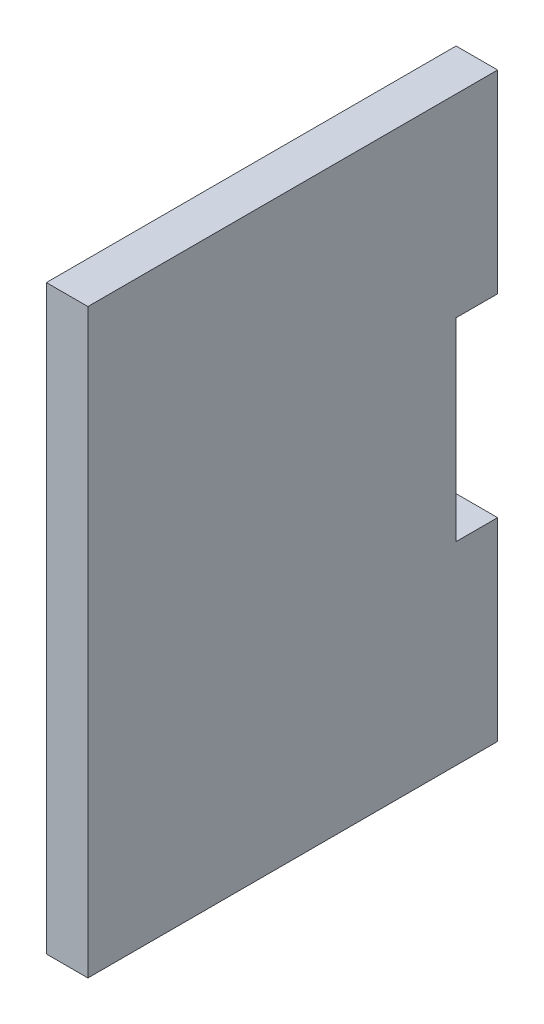
ISO-10303-21;
HEADER;
FILE_DESCRIPTION(('STEP AP214'),'2;1');
FILE_NAME('part.step','',(''),(''),'','','');
FILE_SCHEMA(('AUTOMOTIVE_DESIGN { 1 0 10303 214 1 1 1 1 }'));
ENDSEC;
DATA;
#1=APPLICATION_CONTEXT('core data for automotive mechanical design processes');
#2=APPLICATION_PROTOCOL_DEFINITION('international standard','automotive_design',2000,#1);
#3=PRODUCT_CONTEXT('',#1,'mechanical');
#4=PRODUCT('Part','Part','',(#3));
#5=PRODUCT_RELATED_PRODUCT_CATEGORY('part','',(#4));
#6=PRODUCT_DEFINITION_FORMATION('','',#4);
#7=PRODUCT_DEFINITION_CONTEXT('part definition',#1,'design');
#8=PRODUCT_DEFINITION('design','',#6,#7);
#9=PRODUCT_DEFINITION_SHAPE('','',#8);
#10=(LENGTH_UNIT() NAMED_UNIT(*) SI_UNIT(.MILLI.,.METRE.));
#11=(NAMED_UNIT(*) PLANE_ANGLE_UNIT() SI_UNIT($,.RADIAN.));
#12=(NAMED_UNIT(*) SI_UNIT($,.STERADIAN.) SOLID_ANGLE_UNIT());
#13=UNCERTAINTY_MEASURE_WITH_UNIT(LENGTH_MEASURE(1.E-05),#10,'distance_accuracy_value','');
#14=(GEOMETRIC_REPRESENTATION_CONTEXT(3) GLOBAL_UNCERTAINTY_ASSIGNED_CONTEXT((#13)) GLOBAL_UNIT_ASSIGNED_CONTEXT((#10,
#11,#12)) REPRESENTATION_CONTEXT('',''));
#15=CARTESIAN_POINT('',(0.,0.,0.));
#16=DIRECTION('',(0.,0.,1.));
#17=DIRECTION('',(1.,0.,0.));
#18=AXIS2_PLACEMENT_3D('',#15,#16,#17);
#19=CARTESIAN_POINT('',(3.175,0.,0.));
#20=DIRECTION('',(0.,1.,0.));
#21=DIRECTION('',(0.,0.,1.));
#22=AXIS2_PLACEMENT_3D('',#19,#20,#21);
#23=PLANE('',#22);
#24=DIRECTION('',(0.,0.,-1.));
#25=VECTOR('',#24,1.);
#26=CARTESIAN_POINT('',(0.,0.,0.));
#27=LINE('',#26,#25);
#28=CARTESIAN_POINT('',(0.,0.,0.));
#29=VERTEX_POINT('',#28);
#30=CARTESIAN_POINT('',(0.,0.,-31.3182));
#31=VERTEX_POINT('',#30);
#32=EDGE_CURVE('E131',#29,#31,#27,.T.);
#33=ORIENTED_EDGE('',*,*,#32,.T.);
#34=DIRECTION('',(-1.,0.,0.));
#35=VECTOR('',#34,1.);
#36=CARTESIAN_POINT('',(3.175,0.,-31.3182));
#37=LINE('',#36,#35);
#38=CARTESIAN_POINT('',(3.175,0.,-31.3182));
#39=VERTEX_POINT('',#38);
#40=EDGE_CURVE('E11',#39,#31,#37,.T.);
#41=ORIENTED_EDGE('',*,*,#40,.F.);
#42=DIRECTION('',(0.,0.,-1.));
#43=VECTOR('',#42,1.);
#44=CARTESIAN_POINT('',(3.175,0.,0.));
#45=LINE('',#44,#43);
#46=CARTESIAN_POINT('',(3.175,0.,0.));
#47=VERTEX_POINT('',#46);
#48=EDGE_CURVE('E150',#47,#39,#45,.T.);
#49=ORIENTED_EDGE('',*,*,#48,.F.);
#50=DIRECTION('',(-1.,0.,0.));
#51=VECTOR('',#50,1.);
#52=CARTESIAN_POINT('',(3.175,0.,0.));
#53=LINE('',#52,#51);
#54=EDGE_CURVE('E51',#47,#29,#53,.T.);
#55=ORIENTED_EDGE('',*,*,#54,.T.);
#56=EDGE_LOOP('',(#33,#41,#49,#55));
#57=FACE_BOUND('',#56,.T.);
#58=ADVANCED_FACE('F35',(#57),#23,.F.);
#59=CARTESIAN_POINT('',(3.175,0.,-31.3182));
#60=DIRECTION('',(0.,0.,1.));
#61=DIRECTION('',(1.,0.,0.));
#62=AXIS2_PLACEMENT_3D('',#59,#60,#61);
#63=PLANE('',#62);
#64=DIRECTION('',(0.,1.,0.));
#65=VECTOR('',#64,1.);
#66=CARTESIAN_POINT('',(0.,0.,-31.3182));
#67=LINE('',#66,#65);
#68=CARTESIAN_POINT('',(0.,14.8166666666667,-31.3182));
#69=VERTEX_POINT('',#68);
#70=EDGE_CURVE('E133',#31,#69,#67,.T.);
#71=ORIENTED_EDGE('',*,*,#70,.T.);
#72=DIRECTION('',(-1.,0.,0.));
#73=VECTOR('',#72,1.);
#74=CARTESIAN_POINT('',(3.175,14.8166666666667,-31.3182));
#75=LINE('',#74,#73);
#76=CARTESIAN_POINT('',(3.175,14.8166666666667,-31.3182));
#77=VERTEX_POINT('',#76);
#78=EDGE_CURVE('E43',#77,#69,#75,.T.);
#79=ORIENTED_EDGE('',*,*,#78,.F.);
#80=DIRECTION('',(0.,1.,0.));
#81=VECTOR('',#80,1.);
#82=CARTESIAN_POINT('',(3.175,0.,-31.3182));
#83=LINE('',#82,#81);
#84=EDGE_CURVE('E89',#39,#77,#83,.T.);
#85=ORIENTED_EDGE('',*,*,#84,.F.);
#86=ORIENTED_EDGE('',*,*,#40,.T.);
#87=EDGE_LOOP('',(#71,#79,#85,#86));
#88=FACE_BOUND('',#87,.T.);
#89=ADVANCED_FACE('F164',(#88),#63,.F.);
#90=CARTESIAN_POINT('',(3.175,14.8166666666667,0.));
#91=DIRECTION('',(0.,1.,0.));
#92=DIRECTION('',(0.,0.,1.));
#93=AXIS2_PLACEMENT_3D('',#90,#91,#92);
#94=PLANE('',#93);
#95=DIRECTION('',(0.,0.,-1.));
#96=VECTOR('',#95,1.);
#97=CARTESIAN_POINT('',(0.,14.8166666666667,0.));
#98=LINE('',#97,#96);
#99=CARTESIAN_POINT('',(0.,14.8166666666667,-28.1432));
#100=VERTEX_POINT('',#99);
#101=EDGE_CURVE('E136',#100,#69,#98,.T.);
#102=ORIENTED_EDGE('',*,*,#101,.F.);
#103=DIRECTION('',(-1.,0.,0.));
#104=VECTOR('',#103,1.);
#105=CARTESIAN_POINT('',(3.175,14.8166666666667,-28.1432));
#106=LINE('',#105,#104);
#107=CARTESIAN_POINT('',(3.175,14.8166666666667,-28.1432));
#108=VERTEX_POINT('',#107);
#109=EDGE_CURVE('E157',#108,#100,#106,.T.);
#110=ORIENTED_EDGE('',*,*,#109,.F.);
#111=DIRECTION('',(0.,0.,-1.));
#112=VECTOR('',#111,1.);
#113=CARTESIAN_POINT('',(3.175,14.8166666666667,0.));
#114=LINE('',#113,#112);
#115=EDGE_CURVE('E163',#108,#77,#114,.T.);
#116=ORIENTED_EDGE('',*,*,#115,.T.);
#117=ORIENTED_EDGE('',*,*,#78,.T.);
#118=EDGE_LOOP('',(#102,#110,#116,#117));
#119=FACE_BOUND('',#118,.T.);
#120=ADVANCED_FACE('F161',(#119),#94,.T.);
#121=CARTESIAN_POINT('',(3.175,0.,-28.1432));
#122=DIRECTION('',(0.,0.,1.));
#123=DIRECTION('',(1.,0.,0.));
#124=AXIS2_PLACEMENT_3D('',#121,#122,#123);
#125=PLANE('',#124);
#126=DIRECTION('',(0.,1.,0.));
#127=VECTOR('',#126,1.);
#128=CARTESIAN_POINT('',(0.,0.,-28.1432));
#129=LINE('',#128,#127);
#130=CARTESIAN_POINT('',(0.,29.6333333333333,-28.1432));
#131=VERTEX_POINT('',#130);
#132=EDGE_CURVE('E139',#100,#131,#129,.T.);
#133=ORIENTED_EDGE('',*,*,#132,.T.);
#134=DIRECTION('',(-1.,0.,0.));
#135=VECTOR('',#134,1.);
#136=CARTESIAN_POINT('',(3.175,29.6333333333333,-28.1432));
#137=LINE('',#136,#135);
#138=CARTESIAN_POINT('',(3.175,29.6333333333333,-28.1432));
#139=VERTEX_POINT('',#138);
#140=EDGE_CURVE('E154',#139,#131,#137,.T.);
#141=ORIENTED_EDGE('',*,*,#140,.F.);
#142=DIRECTION('',(0.,1.,0.));
#143=VECTOR('',#142,1.);
#144=CARTESIAN_POINT('',(3.175,0.,-28.1432));
#145=LINE('',#144,#143);
#146=EDGE_CURVE('E176',#108,#139,#145,.T.);
#147=ORIENTED_EDGE('',*,*,#146,.F.);
#148=ORIENTED_EDGE('',*,*,#109,.T.);
#149=EDGE_LOOP('',(#133,#141,#147,#148));
#150=FACE_BOUND('',#149,.T.);
#151=ADVANCED_FACE('F172',(#150),#125,.F.);
#152=CARTESIAN_POINT('',(3.175,29.6333333333333,0.));
#153=DIRECTION('',(0.,1.,0.));
#154=DIRECTION('',(0.,0.,1.));
#155=AXIS2_PLACEMENT_3D('',#152,#153,#154);
#156=PLANE('',#155);
#157=DIRECTION('',(0.,0.,-1.));
#158=VECTOR('',#157,1.);
#159=CARTESIAN_POINT('',(0.,29.6333333333333,0.));
#160=LINE('',#159,#158);
#161=CARTESIAN_POINT('',(0.,29.6333333333333,-31.3182));
#162=VERTEX_POINT('',#161);
#163=EDGE_CURVE('E141',#131,#162,#160,.T.);
#164=ORIENTED_EDGE('',*,*,#163,.T.);
#165=DIRECTION('',(-1.,0.,0.));
#166=VECTOR('',#165,1.);
#167=CARTESIAN_POINT('',(3.175,29.6333333333333,-31.3182));
#168=LINE('',#167,#166);
#169=CARTESIAN_POINT('',(3.175,29.6333333333333,-31.3182));
#170=VERTEX_POINT('',#169);
#171=EDGE_CURVE('E114',#170,#162,#168,.T.);
#172=ORIENTED_EDGE('',*,*,#171,.F.);
#173=DIRECTION('',(0.,0.,-1.));
#174=VECTOR('',#173,1.);
#175=CARTESIAN_POINT('',(3.175,29.6333333333333,0.));
#176=LINE('',#175,#174);
#177=EDGE_CURVE('E122',#139,#170,#176,.T.);
#178=ORIENTED_EDGE('',*,*,#177,.F.);
#179=ORIENTED_EDGE('',*,*,#140,.T.);
#180=EDGE_LOOP('',(#164,#172,#178,#179));
#181=FACE_BOUND('',#180,.T.);
#182=ADVANCED_FACE('F175',(#181),#156,.F.);
#183=CARTESIAN_POINT('',(3.175,0.,-31.3182));
#184=DIRECTION('',(0.,0.,-1.));
#185=DIRECTION('',(-1.,0.,0.));
#186=AXIS2_PLACEMENT_3D('',#183,#184,#185);
#187=PLANE('',#186);
#188=DIRECTION('',(0.,-1.,0.));
#189=VECTOR('',#188,1.);
#190=CARTESIAN_POINT('',(0.,0.,-31.3182));
#191=LINE('',#190,#189);
#192=CARTESIAN_POINT('',(0.,44.45,-31.3182));
#193=VERTEX_POINT('',#192);
#194=EDGE_CURVE('E110',#193,#162,#191,.T.);
#195=ORIENTED_EDGE('',*,*,#194,.F.);
#196=DIRECTION('',(-1.,0.,0.));
#197=VECTOR('',#196,1.);
#198=CARTESIAN_POINT('',(3.175,44.45,-31.3182));
#199=LINE('',#198,#197);
#200=CARTESIAN_POINT('',(3.175,44.45,-31.3182));
#201=VERTEX_POINT('',#200);
#202=EDGE_CURVE('E105',#201,#193,#199,.T.);
#203=ORIENTED_EDGE('',*,*,#202,.F.);
#204=DIRECTION('',(0.,-1.,0.));
#205=VECTOR('',#204,1.);
#206=CARTESIAN_POINT('',(3.175,0.,-31.3182));
#207=LINE('',#206,#205);
#208=EDGE_CURVE('E108',#201,#170,#207,.T.);
#209=ORIENTED_EDGE('',*,*,#208,.T.);
#210=ORIENTED_EDGE('',*,*,#171,.T.);
#211=EDGE_LOOP('',(#195,#203,#209,#210));
#212=FACE_BOUND('',#211,.T.);
#213=ADVANCED_FACE('F107',(#212),#187,.T.);
#214=CARTESIAN_POINT('',(3.175,44.45,0.));
#215=DIRECTION('',(0.,1.,0.));
#216=DIRECTION('',(0.,0.,1.));
#217=AXIS2_PLACEMENT_3D('',#214,#215,#216);
#218=PLANE('',#217);
#219=DIRECTION('',(0.,0.,-1.));
#220=VECTOR('',#219,1.);
#221=CARTESIAN_POINT('',(0.,44.45,0.));
#222=LINE('',#221,#220);
#223=CARTESIAN_POINT('',(0.,44.45,0.));
#224=VERTEX_POINT('',#223);
#225=EDGE_CURVE('E145',#224,#193,#222,.T.);
#226=ORIENTED_EDGE('',*,*,#225,.F.);
#227=DIRECTION('',(-1.,0.,0.));
#228=VECTOR('',#227,1.);
#229=CARTESIAN_POINT('',(3.175,44.45,0.));
#230=LINE('',#229,#228);
#231=CARTESIAN_POINT('',(3.175,44.45,0.));
#232=VERTEX_POINT('',#231);
#233=EDGE_CURVE('E77',#232,#224,#230,.T.);
#234=ORIENTED_EDGE('',*,*,#233,.F.);
#235=DIRECTION('',(0.,0.,-1.));
#236=VECTOR('',#235,1.);
#237=CARTESIAN_POINT('',(3.175,44.45,0.));
#238=LINE('',#237,#236);
#239=EDGE_CURVE('E120',#232,#201,#238,.T.);
#240=ORIENTED_EDGE('',*,*,#239,.T.);
#241=ORIENTED_EDGE('',*,*,#202,.T.);
#242=EDGE_LOOP('',(#226,#234,#240,#241));
#243=FACE_BOUND('',#242,.T.);
#244=ADVANCED_FACE('F125',(#243),#218,.T.);
#245=CARTESIAN_POINT('',(3.175,0.,0.));
#246=DIRECTION('',(0.,0.,1.));
#247=DIRECTION('',(1.,0.,0.));
#248=AXIS2_PLACEMENT_3D('',#245,#246,#247);
#249=PLANE('',#248);
#250=DIRECTION('',(0.,1.,0.));
#251=VECTOR('',#250,1.);
#252=CARTESIAN_POINT('',(0.,0.,0.));
#253=LINE('',#252,#251);
#254=EDGE_CURVE('E147',#29,#224,#253,.T.);
#255=ORIENTED_EDGE('',*,*,#254,.F.);
#256=ORIENTED_EDGE('',*,*,#54,.F.);
#257=DIRECTION('',(0.,1.,0.));
#258=VECTOR('',#257,1.);
#259=CARTESIAN_POINT('',(3.175,0.,0.));
#260=LINE('',#259,#258);
#261=EDGE_CURVE('E126',#47,#232,#260,.T.);
#262=ORIENTED_EDGE('',*,*,#261,.T.);
#263=ORIENTED_EDGE('',*,*,#233,.T.);
#264=EDGE_LOOP('',(#255,#256,#262,#263));
#265=FACE_BOUND('',#264,.T.);
#266=ADVANCED_FACE('F181',(#265),#249,.T.);
#267=CARTESIAN_POINT('',(3.175,0.,0.));
#268=DIRECTION('',(1.,0.,0.));
#269=DIRECTION('',(0.,0.,-1.));
#270=AXIS2_PLACEMENT_3D('',#267,#268,#269);
#271=PLANE('',#270);
#272=ORIENTED_EDGE('',*,*,#48,.T.);
#273=ORIENTED_EDGE('',*,*,#84,.T.);
#274=ORIENTED_EDGE('',*,*,#115,.F.);
#275=ORIENTED_EDGE('',*,*,#146,.T.);
#276=ORIENTED_EDGE('',*,*,#177,.T.);
#277=ORIENTED_EDGE('',*,*,#208,.F.);
#278=ORIENTED_EDGE('',*,*,#239,.F.);
#279=ORIENTED_EDGE('',*,*,#261,.F.);
#280=EDGE_LOOP('',(#272,#273,#274,#275,#276,#277,#278,#279));
#281=FACE_BOUND('',#280,.T.);
#282=ADVANCED_FACE('F118',(#281),#271,.T.);
#283=CARTESIAN_POINT('',(0.,0.,0.));
#284=DIRECTION('',(1.,0.,0.));
#285=DIRECTION('',(0.,0.,-1.));
#286=AXIS2_PLACEMENT_3D('',#283,#284,#285);
#287=PLANE('',#286);
#288=ORIENTED_EDGE('',*,*,#32,.F.);
#289=ORIENTED_EDGE('',*,*,#254,.T.);
#290=ORIENTED_EDGE('',*,*,#225,.T.);
#291=ORIENTED_EDGE('',*,*,#194,.T.);
#292=ORIENTED_EDGE('',*,*,#163,.F.);
#293=ORIENTED_EDGE('',*,*,#132,.F.);
#294=ORIENTED_EDGE('',*,*,#101,.T.);
#295=ORIENTED_EDGE('',*,*,#70,.F.);
#296=EDGE_LOOP('',(#288,#289,#290,#291,#292,#293,#294,#295));
#297=FACE_BOUND('',#296,.T.);
#298=ADVANCED_FACE('F168',(#297),#287,.F.);
#299=CLOSED_SHELL('',(#58,#89,#120,#151,#182,#213,#244,#266,#282,#298));
#300=MANIFOLD_SOLID_BREP('B2',#299);
#301=ADVANCED_BREP_SHAPE_REPRESENTATION('',(#18,#300),#14);
#302=SHAPE_DEFINITION_REPRESENTATION(#9,#301);
ENDSEC;
END-ISO-10303-21;
